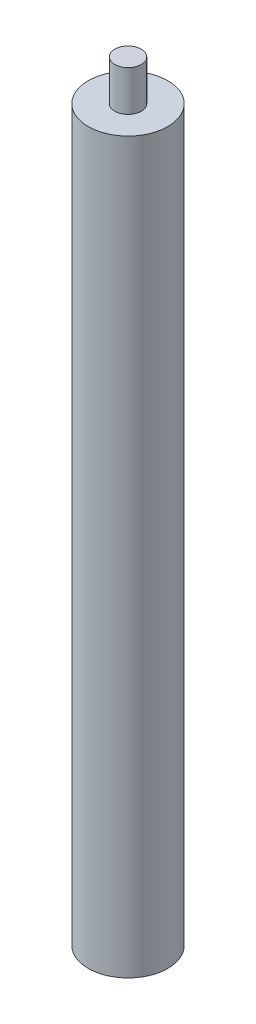
ISO-10303-21;
HEADER;
FILE_DESCRIPTION(('STEP AP214'),'2;1');
FILE_NAME('part.step','',(''),(''),'','','');
FILE_SCHEMA(('AUTOMOTIVE_DESIGN { 1 0 10303 214 1 1 1 1 }'));
ENDSEC;
DATA;
#1=APPLICATION_CONTEXT('core data for automotive mechanical design processes');
#2=APPLICATION_PROTOCOL_DEFINITION('international standard','automotive_design',2000,#1);
#3=PRODUCT_CONTEXT('',#1,'mechanical');
#4=PRODUCT('Part','Part','',(#3));
#5=PRODUCT_RELATED_PRODUCT_CATEGORY('part','',(#4));
#6=PRODUCT_DEFINITION_FORMATION('','',#4);
#7=PRODUCT_DEFINITION_CONTEXT('part definition',#1,'design');
#8=PRODUCT_DEFINITION('design','',#6,#7);
#9=PRODUCT_DEFINITION_SHAPE('','',#8);
#10=(LENGTH_UNIT() NAMED_UNIT(*) SI_UNIT(.MILLI.,.METRE.));
#11=(NAMED_UNIT(*) PLANE_ANGLE_UNIT() SI_UNIT($,.RADIAN.));
#12=(NAMED_UNIT(*) SI_UNIT($,.STERADIAN.) SOLID_ANGLE_UNIT());
#13=UNCERTAINTY_MEASURE_WITH_UNIT(LENGTH_MEASURE(1.E-05),#10,'distance_accuracy_value','');
#14=(GEOMETRIC_REPRESENTATION_CONTEXT(3) GLOBAL_UNCERTAINTY_ASSIGNED_CONTEXT((#13)) GLOBAL_UNIT_ASSIGNED_CONTEXT((#10,
#11,#12)) REPRESENTATION_CONTEXT('',''));
#15=CARTESIAN_POINT('',(0.,0.,0.));
#16=DIRECTION('',(0.,0.,1.));
#17=DIRECTION('',(1.,0.,0.));
#18=AXIS2_PLACEMENT_3D('',#15,#16,#17);
#19=CARTESIAN_POINT('',(1.,57.1126784090102,0.));
#20=DIRECTION('',(0.,1.,0.));
#21=DIRECTION('',(0.,0.,1.));
#22=AXIS2_PLACEMENT_3D('',#19,#20,#21);
#23=PLANE('',#22);
#24=CARTESIAN_POINT('',(0.,57.1126784090102,0.));
#25=DIRECTION('',(0.,-1.,0.));
#26=DIRECTION('',(0.,0.,-1.));
#27=AXIS2_PLACEMENT_3D('',#24,#25,#26);
#28=CIRCLE('',#27,1.);
#29=CARTESIAN_POINT('',(0.,57.1126784090102,-1.));
#30=VERTEX_POINT('',#29);
#31=EDGE_CURVE('E10',#30,#30,#28,.T.);
#32=ORIENTED_EDGE('',*,*,#31,.F.);
#33=EDGE_LOOP('',(#32));
#34=FACE_BOUND('',#33,.T.);
#35=ADVANCED_FACE('F31',(#34),#23,.T.);
#36=CARTESIAN_POINT('',(0.,0.,0.));
#37=DIRECTION('',(0.,-1.,0.));
#38=DIRECTION('',(0.,0.,-1.));
#39=AXIS2_PLACEMENT_3D('',#36,#37,#38);
#40=CYLINDRICAL_SURFACE('',#39,1.);
#41=ORIENTED_EDGE('',*,*,#31,.T.);
#42=EDGE_LOOP('',(#41));
#43=FACE_BOUND('',#42,.T.);
#44=CARTESIAN_POINT('',(0.,54.0555555555556,0.));
#45=DIRECTION('',(0.,-1.,0.));
#46=DIRECTION('',(0.,0.,-1.));
#47=AXIS2_PLACEMENT_3D('',#44,#45,#46);
#48=CIRCLE('',#47,1.);
#49=CARTESIAN_POINT('',(0.,54.0555555555556,-1.));
#50=VERTEX_POINT('',#49);
#51=EDGE_CURVE('E37',#50,#50,#48,.T.);
#52=ORIENTED_EDGE('',*,*,#51,.F.);
#53=EDGE_LOOP('',(#52));
#54=FACE_BOUND('',#53,.T.);
#55=ADVANCED_FACE('F63',(#43,#54),#40,.T.);
#56=CARTESIAN_POINT('',(3.00000000000001,54.0555555555556,0.));
#57=DIRECTION('',(0.,1.,0.));
#58=DIRECTION('',(0.,0.,1.));
#59=AXIS2_PLACEMENT_3D('',#56,#57,#58);
#60=PLANE('',#59);
#61=ORIENTED_EDGE('',*,*,#51,.T.);
#62=EDGE_LOOP('',(#61));
#63=FACE_BOUND('',#62,.T.);
#64=CARTESIAN_POINT('',(0.,54.0555555555556,0.));
#65=DIRECTION('',(0.,-1.,0.));
#66=DIRECTION('',(0.,0.,-1.));
#67=AXIS2_PLACEMENT_3D('',#64,#65,#66);
#68=CIRCLE('',#67,3.00000000000001);
#69=CARTESIAN_POINT('',(0.,54.0555555555556,-3.00000000000001));
#70=VERTEX_POINT('',#69);
#71=EDGE_CURVE('E41',#70,#70,#68,.T.);
#72=ORIENTED_EDGE('',*,*,#71,.F.);
#73=EDGE_LOOP('',(#72));
#74=FACE_BOUND('',#73,.T.);
#75=ADVANCED_FACE('F55',(#63,#74),#60,.T.);
#76=CARTESIAN_POINT('',(0.,0.,0.));
#77=DIRECTION('',(0.,-1.,0.));
#78=DIRECTION('',(0.,0.,-1.));
#79=AXIS2_PLACEMENT_3D('',#76,#77,#78);
#80=CYLINDRICAL_SURFACE('',#79,3.00000000000001);
#81=ORIENTED_EDGE('',*,*,#71,.T.);
#82=EDGE_LOOP('',(#81));
#83=FACE_BOUND('',#82,.T.);
#84=CARTESIAN_POINT('',(0.,-0.944444444444445,0.));
#85=DIRECTION('',(0.,-1.,0.));
#86=DIRECTION('',(0.,0.,-1.));
#87=AXIS2_PLACEMENT_3D('',#84,#85,#86);
#88=CIRCLE('',#87,3.);
#89=CARTESIAN_POINT('',(0.,-0.944444444444445,-3.));
#90=VERTEX_POINT('',#89);
#91=EDGE_CURVE('E45',#90,#90,#88,.T.);
#92=ORIENTED_EDGE('',*,*,#91,.F.);
#93=EDGE_LOOP('',(#92));
#94=FACE_BOUND('',#93,.T.);
#95=ADVANCED_FACE('F53',(#83,#94),#80,.T.);
#96=CARTESIAN_POINT('',(3.,-0.944444444444445,0.));
#97=DIRECTION('',(0.,-1.,0.));
#98=DIRECTION('',(0.,0.,-1.));
#99=AXIS2_PLACEMENT_3D('',#96,#97,#98);
#100=PLANE('',#99);
#101=ORIENTED_EDGE('',*,*,#91,.T.);
#102=EDGE_LOOP('',(#101));
#103=FACE_BOUND('',#102,.T.);
#104=ADVANCED_FACE('F51',(#103),#100,.T.);
#105=CLOSED_SHELL('',(#35,#55,#75,#95,#104));
#106=MANIFOLD_SOLID_BREP('B2',#105);
#107=ADVANCED_BREP_SHAPE_REPRESENTATION('',(#18,#106),#14);
#108=SHAPE_DEFINITION_REPRESENTATION(#9,#107);
ENDSEC;
END-ISO-10303-21;
